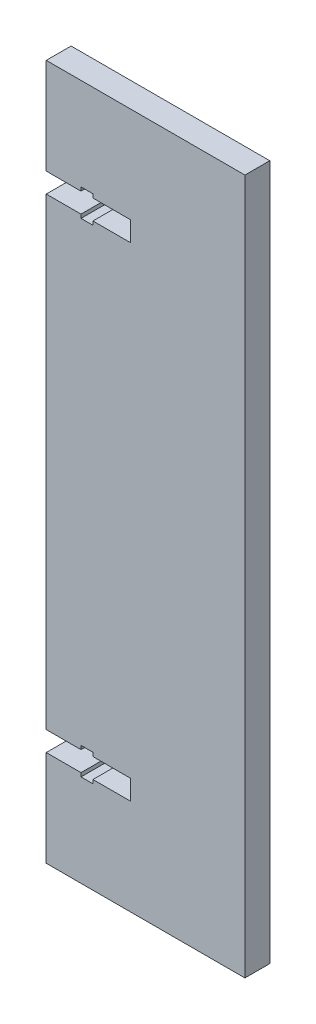
ISO-10303-21;
HEADER;
FILE_DESCRIPTION(('STEP AP214'),'2;1');
FILE_NAME('part.step','',(''),(''),'','','');
FILE_SCHEMA(('AUTOMOTIVE_DESIGN { 1 0 10303 214 1 1 1 1 }'));
ENDSEC;
DATA;
#1=APPLICATION_CONTEXT('core data for automotive mechanical design processes');
#2=APPLICATION_PROTOCOL_DEFINITION('international standard','automotive_design',2000,#1);
#3=PRODUCT_CONTEXT('',#1,'mechanical');
#4=PRODUCT('Part','Part','',(#3));
#5=PRODUCT_RELATED_PRODUCT_CATEGORY('part','',(#4));
#6=PRODUCT_DEFINITION_FORMATION('','',#4);
#7=PRODUCT_DEFINITION_CONTEXT('part definition',#1,'design');
#8=PRODUCT_DEFINITION('design','',#6,#7);
#9=PRODUCT_DEFINITION_SHAPE('','',#8);
#10=(LENGTH_UNIT() NAMED_UNIT(*) SI_UNIT(.MILLI.,.METRE.));
#11=(NAMED_UNIT(*) PLANE_ANGLE_UNIT() SI_UNIT($,.RADIAN.));
#12=(NAMED_UNIT(*) SI_UNIT($,.STERADIAN.) SOLID_ANGLE_UNIT());
#13=UNCERTAINTY_MEASURE_WITH_UNIT(LENGTH_MEASURE(1.E-05),#10,'distance_accuracy_value','');
#14=(GEOMETRIC_REPRESENTATION_CONTEXT(3) GLOBAL_UNCERTAINTY_ASSIGNED_CONTEXT((#13)) GLOBAL_UNIT_ASSIGNED_CONTEXT((#10,
#11,#12)) REPRESENTATION_CONTEXT('',''));
#15=CARTESIAN_POINT('',(0.,0.,0.));
#16=DIRECTION('',(0.,0.,1.));
#17=DIRECTION('',(1.,0.,0.));
#18=AXIS2_PLACEMENT_3D('',#15,#16,#17);
#19=CARTESIAN_POINT('',(-35.2855459673615,88.5616038059075,5.));
#20=DIRECTION('',(1.,0.,0.));
#21=DIRECTION('',(0.,1.,0.));
#22=AXIS2_PLACEMENT_3D('',#19,#20,#21);
#23=PLANE('',#22);
#24=DIRECTION('',(0.,-1.,0.));
#25=VECTOR('',#24,1.);
#26=CARTESIAN_POINT('',(-35.2855459673615,88.5616038059075,5.));
#27=LINE('',#26,#25);
#28=CARTESIAN_POINT('',(-35.2855459673615,65.2517004659075,5.));
#29=VERTEX_POINT('',#28);
#30=CARTESIAN_POINT('',(-35.2855459673614,-28.1284928540924,5.));
#31=VERTEX_POINT('',#30);
#32=EDGE_CURVE('E392',#29,#31,#27,.T.);
#33=ORIENTED_EDGE('',*,*,#32,.F.);
#34=DIRECTION('',(0.,0.,-1.));
#35=VECTOR('',#34,1.);
#36=CARTESIAN_POINT('',(-35.2855459673615,65.2517004659075,10.));
#37=LINE('',#36,#35);
#38=CARTESIAN_POINT('',(-35.2855459673615,65.2517004659075,0.));
#39=VERTEX_POINT('',#38);
#40=EDGE_CURVE('E269',#29,#39,#37,.T.);
#41=ORIENTED_EDGE('',*,*,#40,.T.);
#42=DIRECTION('',(0.,-1.,0.));
#43=VECTOR('',#42,1.);
#44=CARTESIAN_POINT('',(-35.2855459673615,88.5616038059075,0.));
#45=LINE('',#44,#43);
#46=CARTESIAN_POINT('',(-35.2855459673614,-28.1284928540924,0.));
#47=VERTEX_POINT('',#46);
#48=EDGE_CURVE('E403',#39,#47,#45,.T.);
#49=ORIENTED_EDGE('',*,*,#48,.T.);
#50=DIRECTION('',(0.,0.,-1.));
#51=VECTOR('',#50,1.);
#52=CARTESIAN_POINT('',(-35.2855459673614,-28.1284928540924,10.));
#53=LINE('',#52,#51);
#54=EDGE_CURVE('E236',#31,#47,#53,.T.);
#55=ORIENTED_EDGE('',*,*,#54,.F.);
#56=EDGE_LOOP('',(#33,#41,#49,#55));
#57=FACE_BOUND('',#56,.T.);
#58=ADVANCED_FACE('F33',(#57),#23,.F.);
#59=CARTESIAN_POINT('',(-35.2855459673615,88.5616038059075,0.));
#60=VERTEX_POINT('',#59);
#61=CARTESIAN_POINT('',(-35.2855459673615,69.2517004659076,0.));
#62=VERTEX_POINT('',#61);
#63=EDGE_CURVE('E400',#60,#62,#45,.T.);
#64=ORIENTED_EDGE('',*,*,#63,.T.);
#65=DIRECTION('',(0.,0.,-1.));
#66=VECTOR('',#65,1.);
#67=CARTESIAN_POINT('',(-35.2855459673615,69.2517004659075,10.));
#68=LINE('',#67,#66);
#69=CARTESIAN_POINT('',(-35.2855459673615,69.2517004659075,5.));
#70=VERTEX_POINT('',#69);
#71=EDGE_CURVE('E56',#70,#62,#68,.T.);
#72=ORIENTED_EDGE('',*,*,#71,.F.);
#73=CARTESIAN_POINT('',(-35.2855459673615,88.5616038059075,5.));
#74=VERTEX_POINT('',#73);
#75=EDGE_CURVE('E388',#74,#70,#27,.T.);
#76=ORIENTED_EDGE('',*,*,#75,.F.);
#77=DIRECTION('',(0.,0.,-1.));
#78=VECTOR('',#77,1.);
#79=CARTESIAN_POINT('',(-35.2855459673615,88.5616038059075,5.));
#80=LINE('',#79,#78);
#81=EDGE_CURVE('E399',#74,#60,#80,.T.);
#82=ORIENTED_EDGE('',*,*,#81,.T.);
#83=EDGE_LOOP('',(#64,#72,#76,#82));
#84=FACE_BOUND('',#83,.T.);
#85=ADVANCED_FACE('F431',(#84),#23,.F.);
#86=CARTESIAN_POINT('',(-35.2855459673614,-32.1284928540924,5.));
#87=VERTEX_POINT('',#86);
#88=CARTESIAN_POINT('',(-35.2855459673614,-51.4383961940924,5.));
#89=VERTEX_POINT('',#88);
#90=EDGE_CURVE('E393',#87,#89,#27,.T.);
#91=ORIENTED_EDGE('',*,*,#90,.F.);
#92=DIRECTION('',(0.,0.,-1.));
#93=VECTOR('',#92,1.);
#94=CARTESIAN_POINT('',(-35.2855459673614,-32.1284928540924,10.));
#95=LINE('',#94,#93);
#96=CARTESIAN_POINT('',(-35.2855459673614,-32.1284928540924,0.));
#97=VERTEX_POINT('',#96);
#98=EDGE_CURVE('E323',#87,#97,#95,.T.);
#99=ORIENTED_EDGE('',*,*,#98,.T.);
#100=CARTESIAN_POINT('',(-35.2855459673614,-51.4383961940924,0.));
#101=VERTEX_POINT('',#100);
#102=EDGE_CURVE('E387',#97,#101,#45,.T.);
#103=ORIENTED_EDGE('',*,*,#102,.T.);
#104=DIRECTION('',(0.,0.,-1.));
#105=VECTOR('',#104,1.);
#106=CARTESIAN_POINT('',(-35.2855459673614,-51.4383961940924,5.));
#107=LINE('',#106,#105);
#108=EDGE_CURVE('E11',#89,#101,#107,.T.);
#109=ORIENTED_EDGE('',*,*,#108,.F.);
#110=EDGE_LOOP('',(#91,#99,#103,#109));
#111=FACE_BOUND('',#110,.T.);
#112=ADVANCED_FACE('F35',(#111),#23,.F.);
#113=CARTESIAN_POINT('',(-35.2855459673614,-51.4383961940924,5.));
#114=DIRECTION('',(0.,1.,0.));
#115=DIRECTION('',(-1.,0.,0.));
#116=AXIS2_PLACEMENT_3D('',#113,#114,#115);
#117=PLANE('',#116);
#118=DIRECTION('',(1.,0.,0.));
#119=VECTOR('',#118,1.);
#120=CARTESIAN_POINT('',(-35.2855459673614,-51.4383961940924,0.));
#121=LINE('',#120,#119);
#122=CARTESIAN_POINT('',(4.71445403263857,-51.4383961940923,0.));
#123=VERTEX_POINT('',#122);
#124=EDGE_CURVE('E402',#101,#123,#121,.T.);
#125=ORIENTED_EDGE('',*,*,#124,.T.);
#126=DIRECTION('',(0.,0.,-1.));
#127=VECTOR('',#126,1.);
#128=CARTESIAN_POINT('',(4.71445403263857,-51.4383961940923,5.));
#129=LINE('',#128,#127);
#130=CARTESIAN_POINT('',(4.71445403263857,-51.4383961940923,5.));
#131=VERTEX_POINT('',#130);
#132=EDGE_CURVE('E41',#131,#123,#129,.T.);
#133=ORIENTED_EDGE('',*,*,#132,.F.);
#134=DIRECTION('',(1.,0.,0.));
#135=VECTOR('',#134,1.);
#136=CARTESIAN_POINT('',(-35.2855459673614,-51.4383961940924,5.));
#137=LINE('',#136,#135);
#138=EDGE_CURVE('E391',#89,#131,#137,.T.);
#139=ORIENTED_EDGE('',*,*,#138,.F.);
#140=ORIENTED_EDGE('',*,*,#108,.T.);
#141=EDGE_LOOP('',(#125,#133,#139,#140));
#142=FACE_BOUND('',#141,.T.);
#143=ADVANCED_FACE('F438',(#142),#117,.F.);
#144=CARTESIAN_POINT('',(4.71445403263855,88.5616038059075,5.));
#145=DIRECTION('',(-1.,0.,0.));
#146=DIRECTION('',(0.,-1.,0.));
#147=AXIS2_PLACEMENT_3D('',#144,#145,#146);
#148=PLANE('',#147);
#149=DIRECTION('',(0.,1.,0.));
#150=VECTOR('',#149,1.);
#151=CARTESIAN_POINT('',(4.71445403263855,88.5616038059075,0.));
#152=LINE('',#151,#150);
#153=CARTESIAN_POINT('',(4.71445403263855,88.5616038059075,0.));
#154=VERTEX_POINT('',#153);
#155=EDGE_CURVE('E405',#123,#154,#152,.T.);
#156=ORIENTED_EDGE('',*,*,#155,.T.);
#157=DIRECTION('',(0.,0.,-1.));
#158=VECTOR('',#157,1.);
#159=CARTESIAN_POINT('',(4.71445403263855,88.5616038059075,5.));
#160=LINE('',#159,#158);
#161=CARTESIAN_POINT('',(4.71445403263855,88.5616038059075,5.));
#162=VERTEX_POINT('',#161);
#163=EDGE_CURVE('E411',#162,#154,#160,.T.);
#164=ORIENTED_EDGE('',*,*,#163,.F.);
#165=DIRECTION('',(0.,1.,0.));
#166=VECTOR('',#165,1.);
#167=CARTESIAN_POINT('',(4.71445403263855,88.5616038059075,5.));
#168=LINE('',#167,#166);
#169=EDGE_CURVE('E395',#131,#162,#168,.T.);
#170=ORIENTED_EDGE('',*,*,#169,.F.);
#171=ORIENTED_EDGE('',*,*,#132,.T.);
#172=EDGE_LOOP('',(#156,#164,#170,#171));
#173=FACE_BOUND('',#172,.T.);
#174=ADVANCED_FACE('F418',(#173),#148,.F.);
#175=CARTESIAN_POINT('',(-35.2855459673615,88.5616038059075,5.));
#176=DIRECTION('',(0.,-1.,0.));
#177=DIRECTION('',(0.,0.,-1.));
#178=AXIS2_PLACEMENT_3D('',#175,#176,#177);
#179=PLANE('',#178);
#180=DIRECTION('',(-1.,0.,0.));
#181=VECTOR('',#180,1.);
#182=CARTESIAN_POINT('',(-35.2855459673615,88.5616038059075,0.));
#183=LINE('',#182,#181);
#184=EDGE_CURVE('E407',#154,#60,#183,.T.);
#185=ORIENTED_EDGE('',*,*,#184,.T.);
#186=ORIENTED_EDGE('',*,*,#81,.F.);
#187=DIRECTION('',(-1.,0.,0.));
#188=VECTOR('',#187,1.);
#189=CARTESIAN_POINT('',(-35.2855459673615,88.5616038059075,5.));
#190=LINE('',#189,#188);
#191=EDGE_CURVE('E397',#162,#74,#190,.T.);
#192=ORIENTED_EDGE('',*,*,#191,.F.);
#193=ORIENTED_EDGE('',*,*,#163,.T.);
#194=EDGE_LOOP('',(#185,#186,#192,#193));
#195=FACE_BOUND('',#194,.T.);
#196=ADVANCED_FACE('F427',(#195),#179,.F.);
#197=CARTESIAN_POINT('',(0.,0.,5.));
#198=DIRECTION('',(0.,0.,1.));
#199=DIRECTION('',(1.,0.,0.));
#200=AXIS2_PLACEMENT_3D('',#197,#198,#199);
#201=PLANE('',#200);
#202=DIRECTION('',(1.,0.,0.));
#203=VECTOR('',#202,1.);
#204=CARTESIAN_POINT('',(-1.29364179023562E-13,65.2517004659076,5.));
#205=LINE('',#204,#203);
#206=CARTESIAN_POINT('',(-28.2855459673615,65.2517004659076,5.));
#207=VERTEX_POINT('',#206);
#208=EDGE_CURVE('E385',#29,#207,#205,.T.);
#209=ORIENTED_EDGE('',*,*,#208,.F.);
#210=ORIENTED_EDGE('',*,*,#32,.T.);
#211=DIRECTION('',(-1.,0.,0.));
#212=VECTOR('',#211,1.);
#213=CARTESIAN_POINT('',(0.,-28.1284928540925,5.));
#214=LINE('',#213,#212);
#215=CARTESIAN_POINT('',(-28.2855459673614,-28.1284928540924,5.));
#216=VERTEX_POINT('',#215);
#217=EDGE_CURVE('E364',#216,#31,#214,.T.);
#218=ORIENTED_EDGE('',*,*,#217,.F.);
#219=DIRECTION('',(0.,-1.,0.));
#220=VECTOR('',#219,1.);
#221=CARTESIAN_POINT('',(-28.2855459673614,0.,5.));
#222=LINE('',#221,#220);
#223=CARTESIAN_POINT('',(-28.2855459673614,-27.3784928540924,5.));
#224=VERTEX_POINT('',#223);
#225=EDGE_CURVE('E272',#224,#216,#222,.T.);
#226=ORIENTED_EDGE('',*,*,#225,.F.);
#227=DIRECTION('',(-1.,0.,0.));
#228=VECTOR('',#227,1.);
#229=CARTESIAN_POINT('',(0.,-27.3784928540924,5.));
#230=LINE('',#229,#228);
#231=CARTESIAN_POINT('',(-25.8855459673614,-27.3784928540924,5.));
#232=VERTEX_POINT('',#231);
#233=EDGE_CURVE('E346',#232,#224,#230,.T.);
#234=ORIENTED_EDGE('',*,*,#233,.F.);
#235=DIRECTION('',(0.,1.,0.));
#236=VECTOR('',#235,1.);
#237=CARTESIAN_POINT('',(-25.8855459673614,0.,5.));
#238=LINE('',#237,#236);
#239=CARTESIAN_POINT('',(-25.8855459673614,-28.1284928540924,5.));
#240=VERTEX_POINT('',#239);
#241=EDGE_CURVE('E348',#240,#232,#238,.T.);
#242=ORIENTED_EDGE('',*,*,#241,.F.);
#243=DIRECTION('',(-1.,0.,0.));
#244=VECTOR('',#243,1.);
#245=CARTESIAN_POINT('',(0.,-28.1284928540924,5.));
#246=LINE('',#245,#244);
#247=CARTESIAN_POINT('',(-18.2855459673614,-28.1284928540924,5.));
#248=VERTEX_POINT('',#247);
#249=EDGE_CURVE('E350',#248,#240,#246,.T.);
#250=ORIENTED_EDGE('',*,*,#249,.F.);
#251=DIRECTION('',(0.,1.,0.));
#252=VECTOR('',#251,1.);
#253=CARTESIAN_POINT('',(-18.2855459673614,0.,5.));
#254=LINE('',#253,#252);
#255=CARTESIAN_POINT('',(-18.2855459673614,-32.1284928540924,5.));
#256=VERTEX_POINT('',#255);
#257=EDGE_CURVE('E352',#256,#248,#254,.T.);
#258=ORIENTED_EDGE('',*,*,#257,.F.);
#259=DIRECTION('',(1.,0.,0.));
#260=VECTOR('',#259,1.);
#261=CARTESIAN_POINT('',(0.,-32.1284928540925,5.));
#262=LINE('',#261,#260);
#263=CARTESIAN_POINT('',(-25.8855459673614,-32.1284928540924,5.));
#264=VERTEX_POINT('',#263);
#265=EDGE_CURVE('E354',#264,#256,#262,.T.);
#266=ORIENTED_EDGE('',*,*,#265,.F.);
#267=DIRECTION('',(0.,1.,0.));
#268=VECTOR('',#267,1.);
#269=CARTESIAN_POINT('',(-25.8855459673614,0.,5.));
#270=LINE('',#269,#268);
#271=CARTESIAN_POINT('',(-25.8855459673614,-32.8784928540924,5.));
#272=VERTEX_POINT('',#271);
#273=EDGE_CURVE('E356',#272,#264,#270,.T.);
#274=ORIENTED_EDGE('',*,*,#273,.F.);
#275=DIRECTION('',(1.,0.,0.));
#276=VECTOR('',#275,1.);
#277=CARTESIAN_POINT('',(0.,-32.8784928540924,5.));
#278=LINE('',#277,#276);
#279=CARTESIAN_POINT('',(-28.2855459673614,-32.8784928540924,5.));
#280=VERTEX_POINT('',#279);
#281=EDGE_CURVE('E358',#280,#272,#278,.T.);
#282=ORIENTED_EDGE('',*,*,#281,.F.);
#283=DIRECTION('',(0.,-1.,0.));
#284=VECTOR('',#283,1.);
#285=CARTESIAN_POINT('',(-28.2855459673614,0.,5.));
#286=LINE('',#285,#284);
#287=CARTESIAN_POINT('',(-28.2855459673614,-32.1284928540924,5.));
#288=VERTEX_POINT('',#287);
#289=EDGE_CURVE('E360',#288,#280,#286,.T.);
#290=ORIENTED_EDGE('',*,*,#289,.F.);
#291=DIRECTION('',(1.,0.,0.));
#292=VECTOR('',#291,1.);
#293=CARTESIAN_POINT('',(0.,-32.1284928540924,5.));
#294=LINE('',#293,#292);
#295=EDGE_CURVE('E362',#87,#288,#294,.T.);
#296=ORIENTED_EDGE('',*,*,#295,.F.);
#297=ORIENTED_EDGE('',*,*,#90,.T.);
#298=ORIENTED_EDGE('',*,*,#138,.T.);
#299=ORIENTED_EDGE('',*,*,#169,.T.);
#300=ORIENTED_EDGE('',*,*,#191,.T.);
#301=ORIENTED_EDGE('',*,*,#75,.T.);
#302=DIRECTION('',(-1.,0.,0.));
#303=VECTOR('',#302,1.);
#304=CARTESIAN_POINT('',(-1.3729434348517E-13,69.2517004659076,5.));
#305=LINE('',#304,#303);
#306=CARTESIAN_POINT('',(-28.2855459673615,69.2517004659076,5.));
#307=VERTEX_POINT('',#306);
#308=EDGE_CURVE('E366',#307,#70,#305,.T.);
#309=ORIENTED_EDGE('',*,*,#308,.F.);
#310=DIRECTION('',(0.,-1.,0.));
#311=VECTOR('',#310,1.);
#312=CARTESIAN_POINT('',(-28.2855459673615,0.,5.));
#313=LINE('',#312,#311);
#314=CARTESIAN_POINT('',(-28.2855459673615,70.0017004659076,5.));
#315=VERTEX_POINT('',#314);
#316=EDGE_CURVE('E227',#315,#307,#313,.T.);
#317=ORIENTED_EDGE('',*,*,#316,.F.);
#318=DIRECTION('',(-1.,0.,0.));
#319=VECTOR('',#318,1.);
#320=CARTESIAN_POINT('',(8.09557287710039E-13,70.0017004659072,5.));
#321=LINE('',#320,#319);
#322=CARTESIAN_POINT('',(-25.8855459673615,70.0017004659075,5.));
#323=VERTEX_POINT('',#322);
#324=EDGE_CURVE('E369',#323,#315,#321,.T.);
#325=ORIENTED_EDGE('',*,*,#324,.F.);
#326=DIRECTION('',(0.,1.,0.));
#327=VECTOR('',#326,1.);
#328=CARTESIAN_POINT('',(-25.8855459673615,0.,5.));
#329=LINE('',#328,#327);
#330=CARTESIAN_POINT('',(-25.8855459673615,69.2517004659076,5.));
#331=VERTEX_POINT('',#330);
#332=EDGE_CURVE('E371',#331,#323,#329,.T.);
#333=ORIENTED_EDGE('',*,*,#332,.F.);
#334=DIRECTION('',(-1.,0.,0.));
#335=VECTOR('',#334,1.);
#336=CARTESIAN_POINT('',(0.,69.2517004659076,5.));
#337=LINE('',#336,#335);
#338=CARTESIAN_POINT('',(-18.2855459673615,69.2517004659076,5.));
#339=VERTEX_POINT('',#338);
#340=EDGE_CURVE('E373',#339,#331,#337,.T.);
#341=ORIENTED_EDGE('',*,*,#340,.F.);
#342=DIRECTION('',(0.,1.,0.));
#343=VECTOR('',#342,1.);
#344=CARTESIAN_POINT('',(-18.2855459673615,0.,5.));
#345=LINE('',#344,#343);
#346=CARTESIAN_POINT('',(-18.2855459673615,65.2517004659076,5.));
#347=VERTEX_POINT('',#346);
#348=EDGE_CURVE('E375',#347,#339,#345,.T.);
#349=ORIENTED_EDGE('',*,*,#348,.F.);
#350=DIRECTION('',(1.,0.,0.));
#351=VECTOR('',#350,1.);
#352=CARTESIAN_POINT('',(0.,65.2517004659076,5.));
#353=LINE('',#352,#351);
#354=CARTESIAN_POINT('',(-25.8855459673615,65.2517004659076,5.));
#355=VERTEX_POINT('',#354);
#356=EDGE_CURVE('E377',#355,#347,#353,.T.);
#357=ORIENTED_EDGE('',*,*,#356,.F.);
#358=DIRECTION('',(0.,1.,0.));
#359=VECTOR('',#358,1.);
#360=CARTESIAN_POINT('',(-25.8855459673615,0.,5.));
#361=LINE('',#360,#359);
#362=CARTESIAN_POINT('',(-25.8855459673615,64.5017004659076,5.));
#363=VERTEX_POINT('',#362);
#364=EDGE_CURVE('E379',#363,#355,#361,.T.);
#365=ORIENTED_EDGE('',*,*,#364,.F.);
#366=DIRECTION('',(1.,0.,0.));
#367=VECTOR('',#366,1.);
#368=CARTESIAN_POINT('',(0.,64.5017004659076,5.));
#369=LINE('',#368,#367);
#370=CARTESIAN_POINT('',(-28.2855459673615,64.5017004659076,5.));
#371=VERTEX_POINT('',#370);
#372=EDGE_CURVE('E381',#371,#363,#369,.T.);
#373=ORIENTED_EDGE('',*,*,#372,.F.);
#374=DIRECTION('',(0.,-1.,0.));
#375=VECTOR('',#374,1.);
#376=CARTESIAN_POINT('',(-28.2855459673615,0.,5.));
#377=LINE('',#376,#375);
#378=EDGE_CURVE('E383',#207,#371,#377,.T.);
#379=ORIENTED_EDGE('',*,*,#378,.F.);
#380=EDGE_LOOP('',(#209,#210,#218,#226,#234,#242,#250,#258,#266,#274,#282,#290,#296,#297,#298,
#299,#300,#301,#309,#317,#325,#333,#341,#349,#357,#365,#373,#379));
#381=FACE_BOUND('',#380,.T.);
#382=ADVANCED_FACE('F434',(#381),#201,.T.);
#383=CARTESIAN_POINT('',(0.,0.,0.));
#384=DIRECTION('',(0.,0.,1.));
#385=DIRECTION('',(1.,0.,0.));
#386=AXIS2_PLACEMENT_3D('',#383,#384,#385);
#387=PLANE('',#386);
#388=ORIENTED_EDGE('',*,*,#48,.F.);
#389=DIRECTION('',(-1.,0.,0.));
#390=VECTOR('',#389,1.);
#391=CARTESIAN_POINT('',(-35.2855459673615,65.2517004659075,0.));
#392=LINE('',#391,#390);
#393=CARTESIAN_POINT('',(-28.2855459673615,65.2517004659076,0.));
#394=VERTEX_POINT('',#393);
#395=EDGE_CURVE('E267',#394,#39,#392,.T.);
#396=ORIENTED_EDGE('',*,*,#395,.F.);
#397=DIRECTION('',(0.,1.,0.));
#398=VECTOR('',#397,1.);
#399=CARTESIAN_POINT('',(-28.2855459673615,65.2517004659076,0.));
#400=LINE('',#399,#398);
#401=CARTESIAN_POINT('',(-28.2855459673615,64.5017004659076,0.));
#402=VERTEX_POINT('',#401);
#403=EDGE_CURVE('E264',#402,#394,#400,.T.);
#404=ORIENTED_EDGE('',*,*,#403,.F.);
#405=DIRECTION('',(-1.,0.,0.));
#406=VECTOR('',#405,1.);
#407=CARTESIAN_POINT('',(-28.2855459673615,64.5017004659076,0.));
#408=LINE('',#407,#406);
#409=CARTESIAN_POINT('',(-25.8855459673615,64.5017004659076,0.));
#410=VERTEX_POINT('',#409);
#411=EDGE_CURVE('E261',#410,#402,#408,.T.);
#412=ORIENTED_EDGE('',*,*,#411,.F.);
#413=DIRECTION('',(0.,-1.,0.));
#414=VECTOR('',#413,1.);
#415=CARTESIAN_POINT('',(-25.8855459673615,64.5017004659076,0.));
#416=LINE('',#415,#414);
#417=CARTESIAN_POINT('',(-25.8855459673615,65.2517004659076,0.));
#418=VERTEX_POINT('',#417);
#419=EDGE_CURVE('E258',#418,#410,#416,.T.);
#420=ORIENTED_EDGE('',*,*,#419,.F.);
#421=DIRECTION('',(-1.,0.,0.));
#422=VECTOR('',#421,1.);
#423=CARTESIAN_POINT('',(-25.8855459673615,65.2517004659076,0.));
#424=LINE('',#423,#422);
#425=CARTESIAN_POINT('',(-18.2855459673615,65.2517004659076,0.));
#426=VERTEX_POINT('',#425);
#427=EDGE_CURVE('E255',#426,#418,#424,.T.);
#428=ORIENTED_EDGE('',*,*,#427,.F.);
#429=DIRECTION('',(0.,-1.,0.));
#430=VECTOR('',#429,1.);
#431=CARTESIAN_POINT('',(-18.2855459673615,65.2517004659076,0.));
#432=LINE('',#431,#430);
#433=CARTESIAN_POINT('',(-18.2855459673615,69.2517004659076,0.));
#434=VERTEX_POINT('',#433);
#435=EDGE_CURVE('E252',#434,#426,#432,.T.);
#436=ORIENTED_EDGE('',*,*,#435,.F.);
#437=DIRECTION('',(1.,0.,0.));
#438=VECTOR('',#437,1.);
#439=CARTESIAN_POINT('',(-18.2855459673615,69.2517004659076,0.));
#440=LINE('',#439,#438);
#441=CARTESIAN_POINT('',(-25.8855459673615,69.2517004659076,0.));
#442=VERTEX_POINT('',#441);
#443=EDGE_CURVE('E249',#442,#434,#440,.T.);
#444=ORIENTED_EDGE('',*,*,#443,.F.);
#445=DIRECTION('',(0.,-1.,0.));
#446=VECTOR('',#445,1.);
#447=CARTESIAN_POINT('',(-25.8855459673615,69.2517004659076,0.));
#448=LINE('',#447,#446);
#449=CARTESIAN_POINT('',(-25.8855459673615,70.0017004659075,0.));
#450=VERTEX_POINT('',#449);
#451=EDGE_CURVE('E244',#450,#442,#448,.T.);
#452=ORIENTED_EDGE('',*,*,#451,.F.);
#453=DIRECTION('',(1.,0.,0.));
#454=VECTOR('',#453,1.);
#455=CARTESIAN_POINT('',(-25.8855459673615,70.0017004659075,0.));
#456=LINE('',#455,#454);
#457=CARTESIAN_POINT('',(-28.2855459673615,70.0017004659076,0.));
#458=VERTEX_POINT('',#457);
#459=EDGE_CURVE('E242',#458,#450,#456,.T.);
#460=ORIENTED_EDGE('',*,*,#459,.F.);
#461=DIRECTION('',(0.,1.,0.));
#462=VECTOR('',#461,1.);
#463=CARTESIAN_POINT('',(-28.2855459673615,70.0017004659076,0.));
#464=LINE('',#463,#462);
#465=CARTESIAN_POINT('',(-28.2855459673615,69.2517004659076,0.));
#466=VERTEX_POINT('',#465);
#467=EDGE_CURVE('E224',#466,#458,#464,.T.);
#468=ORIENTED_EDGE('',*,*,#467,.F.);
#469=DIRECTION('',(1.,0.,0.));
#470=VECTOR('',#469,1.);
#471=CARTESIAN_POINT('',(-28.2855459673615,69.2517004659076,0.));
#472=LINE('',#471,#470);
#473=EDGE_CURVE('E231',#62,#466,#472,.T.);
#474=ORIENTED_EDGE('',*,*,#473,.F.);
#475=ORIENTED_EDGE('',*,*,#63,.F.);
#476=ORIENTED_EDGE('',*,*,#184,.F.);
#477=ORIENTED_EDGE('',*,*,#155,.F.);
#478=ORIENTED_EDGE('',*,*,#124,.F.);
#479=ORIENTED_EDGE('',*,*,#102,.F.);
#480=DIRECTION('',(-1.,0.,0.));
#481=VECTOR('',#480,1.);
#482=CARTESIAN_POINT('',(-28.2855459673614,-32.1284928540924,0.));
#483=LINE('',#482,#481);
#484=CARTESIAN_POINT('',(-28.2855459673614,-32.1284928540924,0.));
#485=VERTEX_POINT('',#484);
#486=EDGE_CURVE('E319',#485,#97,#483,.T.);
#487=ORIENTED_EDGE('',*,*,#486,.F.);
#488=DIRECTION('',(0.,1.,0.));
#489=VECTOR('',#488,1.);
#490=CARTESIAN_POINT('',(-28.2855459673614,-32.8784928540924,0.));
#491=LINE('',#490,#489);
#492=CARTESIAN_POINT('',(-28.2855459673614,-32.8784928540924,0.));
#493=VERTEX_POINT('',#492);
#494=EDGE_CURVE('E316',#493,#485,#491,.T.);
#495=ORIENTED_EDGE('',*,*,#494,.F.);
#496=DIRECTION('',(-1.,0.,0.));
#497=VECTOR('',#496,1.);
#498=CARTESIAN_POINT('',(-25.8855459673614,-32.8784928540924,0.));
#499=LINE('',#498,#497);
#500=CARTESIAN_POINT('',(-25.8855459673614,-32.8784928540924,0.));
#501=VERTEX_POINT('',#500);
#502=EDGE_CURVE('E313',#501,#493,#499,.T.);
#503=ORIENTED_EDGE('',*,*,#502,.F.);
#504=DIRECTION('',(0.,-1.,0.));
#505=VECTOR('',#504,1.);
#506=CARTESIAN_POINT('',(-25.8855459673614,-32.1284928540924,0.));
#507=LINE('',#506,#505);
#508=CARTESIAN_POINT('',(-25.8855459673614,-32.1284928540924,0.));
#509=VERTEX_POINT('',#508);
#510=EDGE_CURVE('E310',#509,#501,#507,.T.);
#511=ORIENTED_EDGE('',*,*,#510,.F.);
#512=DIRECTION('',(-1.,0.,0.));
#513=VECTOR('',#512,1.);
#514=CARTESIAN_POINT('',(-18.2855459673614,-32.1284928540924,0.));
#515=LINE('',#514,#513);
#516=CARTESIAN_POINT('',(-18.2855459673614,-32.1284928540924,0.));
#517=VERTEX_POINT('',#516);
#518=EDGE_CURVE('E307',#517,#509,#515,.T.);
#519=ORIENTED_EDGE('',*,*,#518,.F.);
#520=DIRECTION('',(0.,-1.,0.));
#521=VECTOR('',#520,1.);
#522=CARTESIAN_POINT('',(-18.2855459673614,-28.1284928540924,0.));
#523=LINE('',#522,#521);
#524=CARTESIAN_POINT('',(-18.2855459673614,-28.1284928540924,0.));
#525=VERTEX_POINT('',#524);
#526=EDGE_CURVE('E304',#525,#517,#523,.T.);
#527=ORIENTED_EDGE('',*,*,#526,.F.);
#528=DIRECTION('',(1.,0.,0.));
#529=VECTOR('',#528,1.);
#530=CARTESIAN_POINT('',(-25.8855459673614,-28.1284928540924,0.));
#531=LINE('',#530,#529);
#532=CARTESIAN_POINT('',(-25.8855459673614,-28.1284928540924,0.));
#533=VERTEX_POINT('',#532);
#534=EDGE_CURVE('E301',#533,#525,#531,.T.);
#535=ORIENTED_EDGE('',*,*,#534,.F.);
#536=DIRECTION('',(0.,-1.,0.));
#537=VECTOR('',#536,1.);
#538=CARTESIAN_POINT('',(-25.8855459673614,-27.3784928540924,0.));
#539=LINE('',#538,#537);
#540=CARTESIAN_POINT('',(-25.8855459673614,-27.3784928540924,0.));
#541=VERTEX_POINT('',#540);
#542=EDGE_CURVE('E298',#541,#533,#539,.T.);
#543=ORIENTED_EDGE('',*,*,#542,.F.);
#544=DIRECTION('',(1.,0.,0.));
#545=VECTOR('',#544,1.);
#546=CARTESIAN_POINT('',(-28.2855459673614,-27.3784928540924,0.));
#547=LINE('',#546,#545);
#548=CARTESIAN_POINT('',(-28.2855459673614,-27.3784928540924,0.));
#549=VERTEX_POINT('',#548);
#550=EDGE_CURVE('E295',#549,#541,#547,.T.);
#551=ORIENTED_EDGE('',*,*,#550,.F.);
#552=DIRECTION('',(0.,1.,0.));
#553=VECTOR('',#552,1.);
#554=CARTESIAN_POINT('',(-28.2855459673614,-28.1284928540924,0.));
#555=LINE('',#554,#553);
#556=CARTESIAN_POINT('',(-28.2855459673614,-28.1284928540924,0.));
#557=VERTEX_POINT('',#556);
#558=EDGE_CURVE('E292',#557,#549,#555,.T.);
#559=ORIENTED_EDGE('',*,*,#558,.F.);
#560=DIRECTION('',(1.,0.,0.));
#561=VECTOR('',#560,1.);
#562=CARTESIAN_POINT('',(-35.2855459673614,-28.1284928540924,0.));
#563=LINE('',#562,#561);
#564=EDGE_CURVE('E48',#47,#557,#563,.T.);
#565=ORIENTED_EDGE('',*,*,#564,.F.);
#566=EDGE_LOOP('',(#388,#396,#404,#412,#420,#428,#436,#444,#452,#460,#468,#474,#475,#476,#477,
#478,#479,#487,#495,#503,#511,#519,#527,#535,#543,#551,#559,#565));
#567=FACE_BOUND('',#566,.T.);
#568=ADVANCED_FACE('F239',(#567),#387,.F.);
#569=CARTESIAN_POINT('',(-35.2855459673614,-28.1284928540924,10.));
#570=DIRECTION('',(0.,1.,0.));
#571=DIRECTION('',(-1.,0.,0.));
#572=AXIS2_PLACEMENT_3D('',#569,#570,#571);
#573=PLANE('',#572);
#574=ORIENTED_EDGE('',*,*,#217,.T.);
#575=ORIENTED_EDGE('',*,*,#54,.T.);
#576=ORIENTED_EDGE('',*,*,#564,.T.);
#577=DIRECTION('',(0.,0.,-1.));
#578=VECTOR('',#577,1.);
#579=CARTESIAN_POINT('',(-28.2855459673614,-28.1284928540924,10.));
#580=LINE('',#579,#578);
#581=EDGE_CURVE('E321',#216,#557,#580,.T.);
#582=ORIENTED_EDGE('',*,*,#581,.F.);
#583=EDGE_LOOP('',(#574,#575,#576,#582));
#584=FACE_BOUND('',#583,.T.);
#585=ADVANCED_FACE('F456',(#584),#573,.F.);
#586=CARTESIAN_POINT('',(-28.2855459673614,-32.1284928540924,10.));
#587=DIRECTION('',(0.,-1.,0.));
#588=DIRECTION('',(0.,0.,-1.));
#589=AXIS2_PLACEMENT_3D('',#586,#587,#588);
#590=PLANE('',#589);
#591=ORIENTED_EDGE('',*,*,#295,.T.);
#592=DIRECTION('',(0.,0.,-1.));
#593=VECTOR('',#592,1.);
#594=CARTESIAN_POINT('',(-28.2855459673614,-32.1284928540924,10.));
#595=LINE('',#594,#593);
#596=EDGE_CURVE('E326',#288,#485,#595,.T.);
#597=ORIENTED_EDGE('',*,*,#596,.T.);
#598=ORIENTED_EDGE('',*,*,#486,.T.);
#599=ORIENTED_EDGE('',*,*,#98,.F.);
#600=EDGE_LOOP('',(#591,#597,#598,#599));
#601=FACE_BOUND('',#600,.T.);
#602=ADVANCED_FACE('F526',(#601),#590,.F.);
#603=CARTESIAN_POINT('',(-28.2855459673614,-32.8784928540924,10.));
#604=DIRECTION('',(-1.,0.,0.));
#605=DIRECTION('',(0.,0.,1.));
#606=AXIS2_PLACEMENT_3D('',#603,#604,#605);
#607=PLANE('',#606);
#608=ORIENTED_EDGE('',*,*,#289,.T.);
#609=DIRECTION('',(0.,0.,-1.));
#610=VECTOR('',#609,1.);
#611=CARTESIAN_POINT('',(-28.2855459673614,-32.8784928540924,10.));
#612=LINE('',#611,#610);
#613=EDGE_CURVE('E328',#280,#493,#612,.T.);
#614=ORIENTED_EDGE('',*,*,#613,.T.);
#615=ORIENTED_EDGE('',*,*,#494,.T.);
#616=ORIENTED_EDGE('',*,*,#596,.F.);
#617=EDGE_LOOP('',(#608,#614,#615,#616));
#618=FACE_BOUND('',#617,.T.);
#619=ADVANCED_FACE('F556',(#618),#607,.F.);
#620=CARTESIAN_POINT('',(-25.8855459673614,-32.8784928540924,10.));
#621=DIRECTION('',(0.,-1.,0.));
#622=DIRECTION('',(1.,0.,0.));
#623=AXIS2_PLACEMENT_3D('',#620,#621,#622);
#624=PLANE('',#623);
#625=ORIENTED_EDGE('',*,*,#281,.T.);
#626=DIRECTION('',(0.,0.,-1.));
#627=VECTOR('',#626,1.);
#628=CARTESIAN_POINT('',(-25.8855459673614,-32.8784928540924,10.));
#629=LINE('',#628,#627);
#630=EDGE_CURVE('E330',#272,#501,#629,.T.);
#631=ORIENTED_EDGE('',*,*,#630,.T.);
#632=ORIENTED_EDGE('',*,*,#502,.T.);
#633=ORIENTED_EDGE('',*,*,#613,.F.);
#634=EDGE_LOOP('',(#625,#631,#632,#633));
#635=FACE_BOUND('',#634,.T.);
#636=ADVANCED_FACE('F552',(#635),#624,.F.);
#637=CARTESIAN_POINT('',(-25.8855459673614,-32.1284928540924,10.));
#638=DIRECTION('',(1.,0.,0.));
#639=DIRECTION('',(0.,0.,-1.));
#640=AXIS2_PLACEMENT_3D('',#637,#638,#639);
#641=PLANE('',#640);
#642=ORIENTED_EDGE('',*,*,#273,.T.);
#643=DIRECTION('',(0.,0.,-1.));
#644=VECTOR('',#643,1.);
#645=CARTESIAN_POINT('',(-25.8855459673614,-32.1284928540924,10.));
#646=LINE('',#645,#644);
#647=EDGE_CURVE('E332',#264,#509,#646,.T.);
#648=ORIENTED_EDGE('',*,*,#647,.T.);
#649=ORIENTED_EDGE('',*,*,#510,.T.);
#650=ORIENTED_EDGE('',*,*,#630,.F.);
#651=EDGE_LOOP('',(#642,#648,#649,#650));
#652=FACE_BOUND('',#651,.T.);
#653=ADVANCED_FACE('F548',(#652),#641,.F.);
#654=CARTESIAN_POINT('',(-18.2855459673614,-32.1284928540924,10.));
#655=DIRECTION('',(0.,-1.,0.));
#656=DIRECTION('',(1.,0.,0.));
#657=AXIS2_PLACEMENT_3D('',#654,#655,#656);
#658=PLANE('',#657);
#659=ORIENTED_EDGE('',*,*,#265,.T.);
#660=DIRECTION('',(0.,0.,-1.));
#661=VECTOR('',#660,1.);
#662=CARTESIAN_POINT('',(-18.2855459673614,-32.1284928540924,10.));
#663=LINE('',#662,#661);
#664=EDGE_CURVE('E334',#256,#517,#663,.T.);
#665=ORIENTED_EDGE('',*,*,#664,.T.);
#666=ORIENTED_EDGE('',*,*,#518,.T.);
#667=ORIENTED_EDGE('',*,*,#647,.F.);
#668=EDGE_LOOP('',(#659,#665,#666,#667));
#669=FACE_BOUND('',#668,.T.);
#670=ADVANCED_FACE('F544',(#669),#658,.F.);
#671=CARTESIAN_POINT('',(-18.2855459673614,-28.1284928540924,10.));
#672=DIRECTION('',(1.,0.,0.));
#673=DIRECTION('',(0.,0.,-1.));
#674=AXIS2_PLACEMENT_3D('',#671,#672,#673);
#675=PLANE('',#674);
#676=ORIENTED_EDGE('',*,*,#257,.T.);
#677=DIRECTION('',(0.,0.,-1.));
#678=VECTOR('',#677,1.);
#679=CARTESIAN_POINT('',(-18.2855459673614,-28.1284928540924,10.));
#680=LINE('',#679,#678);
#681=EDGE_CURVE('E336',#248,#525,#680,.T.);
#682=ORIENTED_EDGE('',*,*,#681,.T.);
#683=ORIENTED_EDGE('',*,*,#526,.T.);
#684=ORIENTED_EDGE('',*,*,#664,.F.);
#685=EDGE_LOOP('',(#676,#682,#683,#684));
#686=FACE_BOUND('',#685,.T.);
#687=ADVANCED_FACE('F540',(#686),#675,.F.);
#688=CARTESIAN_POINT('',(-25.8855459673614,-28.1284928540924,10.));
#689=DIRECTION('',(0.,1.,0.));
#690=DIRECTION('',(-1.,0.,0.));
#691=AXIS2_PLACEMENT_3D('',#688,#689,#690);
#692=PLANE('',#691);
#693=ORIENTED_EDGE('',*,*,#249,.T.);
#694=DIRECTION('',(0.,0.,-1.));
#695=VECTOR('',#694,1.);
#696=CARTESIAN_POINT('',(-25.8855459673614,-28.1284928540924,10.));
#697=LINE('',#696,#695);
#698=EDGE_CURVE('E338',#240,#533,#697,.T.);
#699=ORIENTED_EDGE('',*,*,#698,.T.);
#700=ORIENTED_EDGE('',*,*,#534,.T.);
#701=ORIENTED_EDGE('',*,*,#681,.F.);
#702=EDGE_LOOP('',(#693,#699,#700,#701));
#703=FACE_BOUND('',#702,.T.);
#704=ADVANCED_FACE('F536',(#703),#692,.F.);
#705=CARTESIAN_POINT('',(-25.8855459673614,-27.3784928540924,10.));
#706=DIRECTION('',(1.,0.,0.));
#707=DIRECTION('',(0.,0.,-1.));
#708=AXIS2_PLACEMENT_3D('',#705,#706,#707);
#709=PLANE('',#708);
#710=ORIENTED_EDGE('',*,*,#241,.T.);
#711=DIRECTION('',(0.,0.,-1.));
#712=VECTOR('',#711,1.);
#713=CARTESIAN_POINT('',(-25.8855459673614,-27.3784928540924,10.));
#714=LINE('',#713,#712);
#715=EDGE_CURVE('E340',#232,#541,#714,.T.);
#716=ORIENTED_EDGE('',*,*,#715,.T.);
#717=ORIENTED_EDGE('',*,*,#542,.T.);
#718=ORIENTED_EDGE('',*,*,#698,.F.);
#719=EDGE_LOOP('',(#710,#716,#717,#718));
#720=FACE_BOUND('',#719,.T.);
#721=ADVANCED_FACE('F532',(#720),#709,.F.);
#722=CARTESIAN_POINT('',(-28.2855459673614,-27.3784928540924,10.));
#723=DIRECTION('',(0.,1.,0.));
#724=DIRECTION('',(0.,0.,1.));
#725=AXIS2_PLACEMENT_3D('',#722,#723,#724);
#726=PLANE('',#725);
#727=ORIENTED_EDGE('',*,*,#233,.T.);
#728=DIRECTION('',(0.,0.,-1.));
#729=VECTOR('',#728,1.);
#730=CARTESIAN_POINT('',(-28.2855459673614,-27.3784928540924,10.));
#731=LINE('',#730,#729);
#732=EDGE_CURVE('E342',#224,#549,#731,.T.);
#733=ORIENTED_EDGE('',*,*,#732,.T.);
#734=ORIENTED_EDGE('',*,*,#550,.T.);
#735=ORIENTED_EDGE('',*,*,#715,.F.);
#736=EDGE_LOOP('',(#727,#733,#734,#735));
#737=FACE_BOUND('',#736,.T.);
#738=ADVANCED_FACE('F529',(#737),#726,.F.);
#739=CARTESIAN_POINT('',(-28.2855459673614,-28.1284928540924,10.));
#740=DIRECTION('',(-1.,0.,0.));
#741=DIRECTION('',(0.,0.,1.));
#742=AXIS2_PLACEMENT_3D('',#739,#740,#741);
#743=PLANE('',#742);
#744=ORIENTED_EDGE('',*,*,#225,.T.);
#745=ORIENTED_EDGE('',*,*,#581,.T.);
#746=ORIENTED_EDGE('',*,*,#558,.T.);
#747=ORIENTED_EDGE('',*,*,#732,.F.);
#748=EDGE_LOOP('',(#744,#745,#746,#747));
#749=FACE_BOUND('',#748,.T.);
#750=ADVANCED_FACE('F453',(#749),#743,.F.);
#751=CARTESIAN_POINT('',(-35.2855459673615,65.2517004659075,10.));
#752=DIRECTION('',(0.,-1.,0.));
#753=DIRECTION('',(1.,0.,0.));
#754=AXIS2_PLACEMENT_3D('',#751,#752,#753);
#755=PLANE('',#754);
#756=ORIENTED_EDGE('',*,*,#208,.T.);
#757=DIRECTION('',(0.,0.,-1.));
#758=VECTOR('',#757,1.);
#759=CARTESIAN_POINT('',(-28.2855459673615,65.2517004659076,10.));
#760=LINE('',#759,#758);
#761=EDGE_CURVE('E273',#207,#394,#760,.T.);
#762=ORIENTED_EDGE('',*,*,#761,.T.);
#763=ORIENTED_EDGE('',*,*,#395,.T.);
#764=ORIENTED_EDGE('',*,*,#40,.F.);
#765=EDGE_LOOP('',(#756,#762,#763,#764));
#766=FACE_BOUND('',#765,.T.);
#767=ADVANCED_FACE('F462',(#766),#755,.F.);
#768=CARTESIAN_POINT('',(-28.2855459673615,65.2517004659076,10.));
#769=DIRECTION('',(-1.,0.,0.));
#770=DIRECTION('',(0.,0.,1.));
#771=AXIS2_PLACEMENT_3D('',#768,#769,#770);
#772=PLANE('',#771);
#773=ORIENTED_EDGE('',*,*,#378,.T.);
#774=DIRECTION('',(0.,0.,-1.));
#775=VECTOR('',#774,1.);
#776=CARTESIAN_POINT('',(-28.2855459673615,64.5017004659076,10.));
#777=LINE('',#776,#775);
#778=EDGE_CURVE('E275',#371,#402,#777,.T.);
#779=ORIENTED_EDGE('',*,*,#778,.T.);
#780=ORIENTED_EDGE('',*,*,#403,.T.);
#781=ORIENTED_EDGE('',*,*,#761,.F.);
#782=EDGE_LOOP('',(#773,#779,#780,#781));
#783=FACE_BOUND('',#782,.T.);
#784=ADVANCED_FACE('F464',(#783),#772,.F.);
#785=CARTESIAN_POINT('',(-28.2855459673615,64.5017004659076,10.));
#786=DIRECTION('',(0.,-1.,0.));
#787=DIRECTION('',(0.,0.,-1.));
#788=AXIS2_PLACEMENT_3D('',#785,#786,#787);
#789=PLANE('',#788);
#790=ORIENTED_EDGE('',*,*,#372,.T.);
#791=DIRECTION('',(0.,0.,-1.));
#792=VECTOR('',#791,1.);
#793=CARTESIAN_POINT('',(-25.8855459673615,64.5017004659076,10.));
#794=LINE('',#793,#792);
#795=EDGE_CURVE('E277',#363,#410,#794,.T.);
#796=ORIENTED_EDGE('',*,*,#795,.T.);
#797=ORIENTED_EDGE('',*,*,#411,.T.);
#798=ORIENTED_EDGE('',*,*,#778,.F.);
#799=EDGE_LOOP('',(#790,#796,#797,#798));
#800=FACE_BOUND('',#799,.T.);
#801=ADVANCED_FACE('F470',(#800),#789,.F.);
#802=CARTESIAN_POINT('',(-25.8855459673615,64.5017004659076,10.));
#803=DIRECTION('',(1.,0.,0.));
#804=DIRECTION('',(0.,0.,-1.));
#805=AXIS2_PLACEMENT_3D('',#802,#803,#804);
#806=PLANE('',#805);
#807=ORIENTED_EDGE('',*,*,#364,.T.);
#808=DIRECTION('',(0.,0.,-1.));
#809=VECTOR('',#808,1.);
#810=CARTESIAN_POINT('',(-25.8855459673615,65.2517004659076,10.));
#811=LINE('',#810,#809);
#812=EDGE_CURVE('E279',#355,#418,#811,.T.);
#813=ORIENTED_EDGE('',*,*,#812,.T.);
#814=ORIENTED_EDGE('',*,*,#419,.T.);
#815=ORIENTED_EDGE('',*,*,#795,.F.);
#816=EDGE_LOOP('',(#807,#813,#814,#815));
#817=FACE_BOUND('',#816,.T.);
#818=ADVANCED_FACE('F474',(#817),#806,.F.);
#819=CARTESIAN_POINT('',(-25.8855459673615,65.2517004659076,10.));
#820=DIRECTION('',(0.,-1.,0.));
#821=DIRECTION('',(0.,0.,-1.));
#822=AXIS2_PLACEMENT_3D('',#819,#820,#821);
#823=PLANE('',#822);
#824=ORIENTED_EDGE('',*,*,#356,.T.);
#825=DIRECTION('',(0.,0.,-1.));
#826=VECTOR('',#825,1.);
#827=CARTESIAN_POINT('',(-18.2855459673615,65.2517004659076,10.));
#828=LINE('',#827,#826);
#829=EDGE_CURVE('E281',#347,#426,#828,.T.);
#830=ORIENTED_EDGE('',*,*,#829,.T.);
#831=ORIENTED_EDGE('',*,*,#427,.T.);
#832=ORIENTED_EDGE('',*,*,#812,.F.);
#833=EDGE_LOOP('',(#824,#830,#831,#832));
#834=FACE_BOUND('',#833,.T.);
#835=ADVANCED_FACE('F478',(#834),#823,.F.);
#836=CARTESIAN_POINT('',(-18.2855459673615,65.2517004659076,10.));
#837=DIRECTION('',(1.,0.,0.));
#838=DIRECTION('',(0.,0.,-1.));
#839=AXIS2_PLACEMENT_3D('',#836,#837,#838);
#840=PLANE('',#839);
#841=ORIENTED_EDGE('',*,*,#348,.T.);
#842=DIRECTION('',(0.,0.,-1.));
#843=VECTOR('',#842,1.);
#844=CARTESIAN_POINT('',(-18.2855459673615,69.2517004659076,10.));
#845=LINE('',#844,#843);
#846=EDGE_CURVE('E283',#339,#434,#845,.T.);
#847=ORIENTED_EDGE('',*,*,#846,.T.);
#848=ORIENTED_EDGE('',*,*,#435,.T.);
#849=ORIENTED_EDGE('',*,*,#829,.F.);
#850=EDGE_LOOP('',(#841,#847,#848,#849));
#851=FACE_BOUND('',#850,.T.);
#852=ADVANCED_FACE('F483',(#851),#840,.F.);
#853=CARTESIAN_POINT('',(-18.2855459673615,69.2517004659076,10.));
#854=DIRECTION('',(0.,1.,0.));
#855=DIRECTION('',(0.,0.,1.));
#856=AXIS2_PLACEMENT_3D('',#853,#854,#855);
#857=PLANE('',#856);
#858=ORIENTED_EDGE('',*,*,#340,.T.);
#859=DIRECTION('',(0.,0.,-1.));
#860=VECTOR('',#859,1.);
#861=CARTESIAN_POINT('',(-25.8855459673615,69.2517004659076,10.));
#862=LINE('',#861,#860);
#863=EDGE_CURVE('E285',#331,#442,#862,.T.);
#864=ORIENTED_EDGE('',*,*,#863,.T.);
#865=ORIENTED_EDGE('',*,*,#443,.T.);
#866=ORIENTED_EDGE('',*,*,#846,.F.);
#867=EDGE_LOOP('',(#858,#864,#865,#866));
#868=FACE_BOUND('',#867,.T.);
#869=ADVANCED_FACE('F488',(#868),#857,.F.);
#870=CARTESIAN_POINT('',(-25.8855459673615,69.2517004659076,10.));
#871=DIRECTION('',(1.,0.,0.));
#872=DIRECTION('',(0.,0.,-1.));
#873=AXIS2_PLACEMENT_3D('',#870,#871,#872);
#874=PLANE('',#873);
#875=ORIENTED_EDGE('',*,*,#332,.T.);
#876=DIRECTION('',(0.,0.,-1.));
#877=VECTOR('',#876,1.);
#878=CARTESIAN_POINT('',(-25.8855459673615,70.0017004659075,10.));
#879=LINE('',#878,#877);
#880=EDGE_CURVE('E287',#323,#450,#879,.T.);
#881=ORIENTED_EDGE('',*,*,#880,.T.);
#882=ORIENTED_EDGE('',*,*,#451,.T.);
#883=ORIENTED_EDGE('',*,*,#863,.F.);
#884=EDGE_LOOP('',(#875,#881,#882,#883));
#885=FACE_BOUND('',#884,.T.);
#886=ADVANCED_FACE('F492',(#885),#874,.F.);
#887=CARTESIAN_POINT('',(-25.8855459673615,70.0017004659075,10.));
#888=DIRECTION('',(0.,1.,0.));
#889=DIRECTION('',(-1.,0.,0.));
#890=AXIS2_PLACEMENT_3D('',#887,#888,#889);
#891=PLANE('',#890);
#892=ORIENTED_EDGE('',*,*,#324,.T.);
#893=DIRECTION('',(0.,0.,-1.));
#894=VECTOR('',#893,1.);
#895=CARTESIAN_POINT('',(-28.2855459673615,70.0017004659076,10.));
#896=LINE('',#895,#894);
#897=EDGE_CURVE('E229',#315,#458,#896,.T.);
#898=ORIENTED_EDGE('',*,*,#897,.T.);
#899=ORIENTED_EDGE('',*,*,#459,.T.);
#900=ORIENTED_EDGE('',*,*,#880,.F.);
#901=EDGE_LOOP('',(#892,#898,#899,#900));
#902=FACE_BOUND('',#901,.T.);
#903=ADVANCED_FACE('F496',(#902),#891,.F.);
#904=CARTESIAN_POINT('',(-28.2855459673615,70.0017004659076,10.));
#905=DIRECTION('',(-1.,0.,0.));
#906=DIRECTION('',(0.,0.,1.));
#907=AXIS2_PLACEMENT_3D('',#904,#905,#906);
#908=PLANE('',#907);
#909=ORIENTED_EDGE('',*,*,#316,.T.);
#910=DIRECTION('',(0.,0.,-1.));
#911=VECTOR('',#910,1.);
#912=CARTESIAN_POINT('',(-28.2855459673615,69.2517004659076,10.));
#913=LINE('',#912,#911);
#914=EDGE_CURVE('E220',#307,#466,#913,.T.);
#915=ORIENTED_EDGE('',*,*,#914,.T.);
#916=ORIENTED_EDGE('',*,*,#467,.T.);
#917=ORIENTED_EDGE('',*,*,#897,.F.);
#918=EDGE_LOOP('',(#909,#915,#916,#917));
#919=FACE_BOUND('',#918,.T.);
#920=ADVANCED_FACE('F221',(#919),#908,.F.);
#921=CARTESIAN_POINT('',(-28.2855459673615,69.2517004659076,10.));
#922=DIRECTION('',(0.,1.,0.));
#923=DIRECTION('',(-1.,0.,0.));
#924=AXIS2_PLACEMENT_3D('',#921,#922,#923);
#925=PLANE('',#924);
#926=ORIENTED_EDGE('',*,*,#308,.T.);
#927=ORIENTED_EDGE('',*,*,#71,.T.);
#928=ORIENTED_EDGE('',*,*,#473,.T.);
#929=ORIENTED_EDGE('',*,*,#914,.F.);
#930=EDGE_LOOP('',(#926,#927,#928,#929));
#931=FACE_BOUND('',#930,.T.);
#932=ADVANCED_FACE('F232',(#931),#925,.F.);
#933=CLOSED_SHELL('',(#58,#85,#112,#143,#174,#196,#382,#568,#585,#602,#619,#636,#653,#670,#687,
#704,#721,#738,#750,#767,#784,#801,#818,#835,#852,#869,#886,#903,#920,#932));
#934=MANIFOLD_SOLID_BREP('B2',#933);
#935=ADVANCED_BREP_SHAPE_REPRESENTATION('',(#18,#934),#14);
#936=SHAPE_DEFINITION_REPRESENTATION(#9,#935);
ENDSEC;
END-ISO-10303-21;
